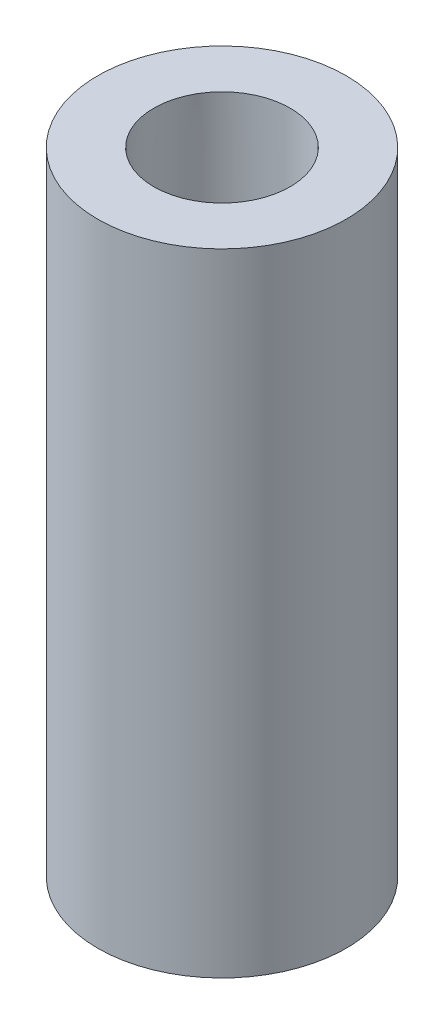
ISO-10303-21;
HEADER;
FILE_DESCRIPTION(('STEP AP214'),'2;1');
FILE_NAME('part.step','',(''),(''),'','','');
FILE_SCHEMA(('AUTOMOTIVE_DESIGN { 1 0 10303 214 1 1 1 1 }'));
ENDSEC;
DATA;
#1=APPLICATION_CONTEXT('core data for automotive mechanical design processes');
#2=APPLICATION_PROTOCOL_DEFINITION('international standard','automotive_design',2000,#1);
#3=PRODUCT_CONTEXT('',#1,'mechanical');
#4=PRODUCT('Part','Part','',(#3));
#5=PRODUCT_RELATED_PRODUCT_CATEGORY('part','',(#4));
#6=PRODUCT_DEFINITION_FORMATION('','',#4);
#7=PRODUCT_DEFINITION_CONTEXT('part definition',#1,'design');
#8=PRODUCT_DEFINITION('design','',#6,#7);
#9=PRODUCT_DEFINITION_SHAPE('','',#8);
#10=(LENGTH_UNIT() NAMED_UNIT(*) SI_UNIT(.MILLI.,.METRE.));
#11=(NAMED_UNIT(*) PLANE_ANGLE_UNIT() SI_UNIT($,.RADIAN.));
#12=(NAMED_UNIT(*) SI_UNIT($,.STERADIAN.) SOLID_ANGLE_UNIT());
#13=UNCERTAINTY_MEASURE_WITH_UNIT(LENGTH_MEASURE(1.E-05),#10,'distance_accuracy_value','');
#14=(GEOMETRIC_REPRESENTATION_CONTEXT(3) GLOBAL_UNCERTAINTY_ASSIGNED_CONTEXT((#13)) GLOBAL_UNIT_ASSIGNED_CONTEXT((#10,
#11,#12)) REPRESENTATION_CONTEXT('',''));
#15=CARTESIAN_POINT('',(0.,0.,0.));
#16=DIRECTION('',(0.,0.,1.));
#17=DIRECTION('',(1.,0.,0.));
#18=AXIS2_PLACEMENT_3D('',#15,#16,#17);
#19=CARTESIAN_POINT('',(-7.29247561548427,-19.585017995497,0.));
#20=DIRECTION('',(0.,-1.,0.));
#21=DIRECTION('',(0.,0.,-1.));
#22=AXIS2_PLACEMENT_3D('',#19,#20,#21);
#23=PLANE('',#22);
#24=CARTESIAN_POINT('',(0.,-19.585017995497,0.));
#25=DIRECTION('',(0.,1.,0.));
#26=DIRECTION('',(0.,0.,1.));
#27=AXIS2_PLACEMENT_3D('',#24,#25,#26);
#28=CIRCLE('',#27,2.49500000000001);
#29=CARTESIAN_POINT('',(0.,-19.585017995497,2.49500000000001));
#30=VERTEX_POINT('',#29);
#31=EDGE_CURVE('E46',#30,#30,#28,.T.);
#32=ORIENTED_EDGE('',*,*,#31,.T.);
#33=EDGE_LOOP('',(#32));
#34=FACE_BOUND('',#33,.T.);
#35=CARTESIAN_POINT('',(0.,-19.585017995497,0.));
#36=DIRECTION('',(0.,1.,0.));
#37=DIRECTION('',(0.,0.,1.));
#38=AXIS2_PLACEMENT_3D('',#35,#36,#37);
#39=CIRCLE('',#38,7.29247561548427);
#40=CARTESIAN_POINT('',(0.,-19.585017995497,7.29247561548427));
#41=VERTEX_POINT('',#40);
#42=EDGE_CURVE('E112',#41,#41,#39,.T.);
#43=ORIENTED_EDGE('',*,*,#42,.F.);
#44=EDGE_LOOP('',(#43));
#45=FACE_BOUND('',#44,.T.);
#46=ADVANCED_FACE('F31',(#34,#45),#23,.T.);
#47=CARTESIAN_POINT('',(0.,0.,0.));
#48=DIRECTION('',(0.,1.,0.));
#49=DIRECTION('',(0.,0.,1.));
#50=AXIS2_PLACEMENT_3D('',#47,#48,#49);
#51=CYLINDRICAL_SURFACE('',#50,2.49500000000001);
#52=CARTESIAN_POINT('',(2.,-9.79250899774851,-1.49165176901315));
#53=CARTESIAN_POINT('',(1.99998982466606,-9.71762488247213,-1.49167489274666));
#54=CARTESIAN_POINT('',(1.99574498655588,-9.64262984351396,-1.49740945606474));
#55=CARTESIAN_POINT('',(1.97915654142002,-9.49499776509533,-1.51925388355635));
#56=CARTESIAN_POINT('',(1.96678548125908,-9.42236959783292,-1.53539891441364));
#57=CARTESIAN_POINT('',(1.92924680344212,-9.25623840512728,-1.58246947915428));
#58=CARTESIAN_POINT('',(1.90111427849825,-9.16433750389393,-1.61659173983646));
#59=CARTESIAN_POINT('',(1.83361327224915,-8.98826631921876,-1.69277529359761));
#60=CARTESIAN_POINT('',(1.79421273527494,-8.90411900960605,-1.7348591187445));
#61=CARTESIAN_POINT('',(1.68893774586292,-8.7139737705995,-1.83841298141847));
#62=CARTESIAN_POINT('',(1.61864953572238,-8.61121235780178,-1.90135194853876));
#63=CARTESIAN_POINT('',(1.45994146979673,-8.41993064398826,-2.02578153122402));
#64=CARTESIAN_POINT('',(1.37153689545229,-8.3313984519734,-2.08727331908748));
#65=CARTESIAN_POINT('',(1.19619190276097,-8.18647073468363,-2.19143752418844));
#66=CARTESIAN_POINT('',(1.11243236020543,-8.12718339979482,-2.23542463288515));
#67=CARTESIAN_POINT('',(0.934056110916949,-8.02099228900925,-2.31561756072523));
#68=CARTESIAN_POINT('',(0.839456636099224,-7.97406923931981,-2.35183547412224));
#69=CARTESIAN_POINT('',(0.657083535405999,-7.90141135380085,-2.40849537899264));
#70=CARTESIAN_POINT('',(0.570691989746865,-7.87347417308106,-2.43054344633927));
#71=CARTESIAN_POINT('',(0.393150734970539,-7.8294043065651,-2.46548629446566));
#72=CARTESIAN_POINT('',(0.302003664579057,-7.8132651474165,-2.47838609461122));
#73=CARTESIAN_POINT('',(0.117141567273759,-7.79377379440852,-2.49397927286203));
#74=CARTESIAN_POINT('',(0.0234187082998375,-7.79046629062994,-2.49663697959767));
#75=CARTESIAN_POINT('',(-0.163268092184571,-7.79699718367013,-2.4914029310305));
#76=CARTESIAN_POINT('',(-0.256232001460473,-7.80683613596089,-2.48351072996661));
#77=CARTESIAN_POINT('',(-0.433487704804791,-7.83809159412591,-2.45859517652351));
#78=CARTESIAN_POINT('',(-0.517975128014014,-7.85884058743156,-2.4420986888115));
#79=CARTESIAN_POINT('',(-0.681874784745272,-7.91037340490264,-2.40150123178631));
#80=CARTESIAN_POINT('',(-0.761285726943328,-7.94115977025995,-2.37739833678555));
#81=CARTESIAN_POINT('',(-0.921140033084898,-8.01487637725988,-2.32043140165434));
#82=CARTESIAN_POINT('',(-1.00095225980917,-8.05868800079259,-2.28694889017801));
#83=CARTESIAN_POINT('',(-1.15222231005388,-8.15530058453991,-2.21459965280143));
#84=CARTESIAN_POINT('',(-1.22367549312921,-8.20810649827962,-2.17572996216981));
#85=CARTESIAN_POINT('',(-1.3717541020858,-8.3332169099053,-2.08620672146452));
#86=CARTESIAN_POINT('',(-1.44640685502858,-8.40729668642323,-2.0347762124977));
#87=CARTESIAN_POINT('',(-1.58296204551038,-8.56564854800117,-1.93045064795466));
#88=CARTESIAN_POINT('',(-1.64484845305624,-8.64993323870965,-1.87755384459038));
#89=CARTESIAN_POINT('',(-1.75032359684048,-8.8201620299209,-1.77935139615749));
#90=CARTESIAN_POINT('',(-1.79507104936191,-8.90524221914106,-1.73379481673728));
#91=CARTESIAN_POINT('',(-1.87275053722992,-9.08381683377043,-1.64957404744195));
#92=CARTESIAN_POINT('',(-1.90570838416486,-9.17729231016451,-1.61089489507782));
#93=CARTESIAN_POINT('',(-1.94997252725841,-9.3425062783132,-1.55674941035522));
#94=CARTESIAN_POINT('',(-1.9648188997743,-9.41212560534172,-1.53780195882057));
#95=CARTESIAN_POINT('',(-1.98706198759959,-9.55431535677362,-1.50895655009514));
#96=CARTESIAN_POINT('',(-1.99447550653383,-9.62687873698373,-1.49903818533492));
#97=CARTESIAN_POINT('',(-2.00126216673061,-9.77353015575105,-1.48997177667801));
#98=CARTESIAN_POINT('',(-2.00058713910168,-9.84762470247897,-1.49088825598389));
#99=CARTESIAN_POINT('',(-1.99114760336213,-9.99440262256299,-1.50346538347711));
#100=CARTESIAN_POINT('',(-1.98237181387586,-10.0670838835697,-1.51514101515961));
#101=CARTESIAN_POINT('',(-1.95434360682725,-10.2268779923362,-1.55119078789946));
#102=CARTESIAN_POINT('',(-1.93301984360635,-10.3130537261043,-1.57801059042187));
#103=CARTESIAN_POINT('',(-1.88048925430475,-10.4790883674332,-1.64025732065243));
#104=CARTESIAN_POINT('',(-1.84925282594222,-10.5589274473276,-1.67570995390655));
#105=CARTESIAN_POINT('',(-1.76142774781795,-10.7478749672857,-1.7686543767474));
#106=CARTESIAN_POINT('',(-1.69980191947365,-10.8533609115266,-1.82873602297468));
#107=CARTESIAN_POINT('',(-1.55903272490304,-11.0511390818371,-1.95016552386859));
#108=CARTESIAN_POINT('',(-1.47986830782118,-11.1434152317602,-2.01151481912313));
#109=CARTESIAN_POINT('',(-1.30297270705835,-11.3148933837964,-2.13045317021217));
#110=CARTESIAN_POINT('',(-1.20498080481901,-11.3938784831317,-2.18797200881422));
#111=CARTESIAN_POINT('',(-0.99201980728713,-11.5337715599526,-2.29235040362655));
#112=CARTESIAN_POINT('',(-0.877107471993559,-11.5947380011428,-2.33924431547544));
#113=CARTESIAN_POINT('',(-0.672327151145077,-11.67823859994,-2.40428044510312));
#114=CARTESIAN_POINT('',(-0.586305995402787,-11.7068267667444,-2.42681866213397));
#115=CARTESIAN_POINT('',(-0.409388118520747,-11.7522838020565,-2.46283298929266));
#116=CARTESIAN_POINT('',(-0.318495185739363,-11.769161638238,-2.47631603354238));
#117=CARTESIAN_POINT('',(-0.133950900946632,-11.790185563701,-2.49312987518579));
#118=CARTESIAN_POINT('',(-0.0402905062151502,-11.7942838149761,-2.49642252638842));
#119=CARTESIAN_POINT('',(0.146457885474472,-11.789324993236,-2.49244793570538));
#120=CARTESIAN_POINT('',(0.239545850261643,-11.7802671875054,-2.48518010566272));
#121=CARTESIAN_POINT('',(0.417166363855428,-11.7504768454989,-2.46142008760398));
#122=CARTESIAN_POINT('',(0.501887187561254,-11.7304188407559,-2.44546119686886));
#123=CARTESIAN_POINT('',(0.666357872024764,-11.6801976026301,-2.40585857045395));
#124=CARTESIAN_POINT('',(0.746106435320406,-11.650031744684,-2.38221283888845));
#125=CARTESIAN_POINT('',(0.9063665517643,-11.5777039853399,-2.32623575314042));
#126=CARTESIAN_POINT('',(0.986285957947629,-11.5346996891254,-2.29330944155594));
#127=CARTESIAN_POINT('',(1.1378812764632,-11.439700782837,-2.22199935985838));
#128=CARTESIAN_POINT('',(1.20955295709267,-11.387701591652,-2.18361281061843));
#129=CARTESIAN_POINT('',(1.35807755910617,-11.2644968624993,-2.09512852968524));
#130=CARTESIAN_POINT('',(1.43300117367251,-11.1915375290602,-2.04423980164582));
#131=CARTESIAN_POINT('',(1.57027734837633,-11.0355096418236,-1.94078443006735));
#132=CARTESIAN_POINT('',(1.63261344630004,-10.9524280746077,-1.88821569206073));
#133=CARTESIAN_POINT('',(1.74043817097857,-10.7826068090697,-1.78910007048878));
#134=CARTESIAN_POINT('',(1.78679170651862,-10.6965136358514,-1.7423878419969));
#135=CARTESIAN_POINT('',(1.86733148372942,-10.5155826735051,-1.65577103672732));
#136=CARTESIAN_POINT('',(1.9015406159041,-10.4207617645407,-1.61585372722828));
#137=CARTESIAN_POINT('',(1.9476685961153,-10.2526309684977,-1.55965323299791));
#138=CARTESIAN_POINT('',(1.96320062506381,-10.1815070665511,-1.53987365225458));
#139=CARTESIAN_POINT('',(1.98645272484821,-10.0361552139781,-1.50977194399549));
#140=CARTESIAN_POINT('',(1.99420265976459,-9.9619402768445,-1.49941367637286));
#141=CARTESIAN_POINT('',(1.99925328893917,-9.85574083720402,-1.49265094493208));
#142=CARTESIAN_POINT('',(2.00000429734928,-9.82413480979829,-1.49164200316565));
#143=CARTESIAN_POINT('',(2.,-9.79250899774851,-1.49165176901315));
#144=B_SPLINE_CURVE_WITH_KNOTS('',3,(#52,#53,#54,#55,#56,#57,#58,#59,#60,#61,#62,#63,#64,#65,
#66,#67,#68,#69,#70,#71,#72,#73,#74,#75,#76,#77,#78,#79,#80,#81,#82,#83,#84,#85,#86,#87,#88,#89,
#90,#91,#92,#93,#94,#95,#96,#97,#98,#99,#100,#101,#102,#103,#104,#105,#106,#107,#108,#109,#110,
#111,#112,#113,#114,#115,#116,#117,#118,#119,#120,#121,#122,#123,#124,#125,#126,#127,#128,#129,
#130,#131,#132,#133,#134,#135,#136,#137,#138,#139,#140,#141,#142,#143),.UNSPECIFIED.,.T.,.F.,(4,
2,2,2,2,2,2,2,2,2,2,2,2,2,2,2,2,2,2,2,2,2,2,2,2,2,2,2,2,2,2,2,2,2,2,2,2,2,2,2,2,2,2,2,2,4),(0.,
0.224540218510251,0.449842938623357,0.754087052814664,1.05920545199384,1.47570337962549,
1.89185142017391,2.22554056758936,2.55870643194784,2.8378267833189,3.11679387142062,
3.39673167826465,3.67668131358377,3.94121195444774,4.20580961940828,4.49577882936285,
4.78590825672258,5.13587564398762,5.48627982646593,5.80449053033697,6.12200023265026,
6.34219094402662,6.56188273504306,6.78288348104597,7.00419246472156,7.28085325020292,
7.55834813065941,7.96469001161735,8.37152227626493,8.78445775487322,9.19603832305256,
9.47511904116691,9.75398580500093,10.0338952093845,10.3138202036811,10.5782384217956,
10.8427253509242,11.13130329789,11.4200286530294,11.767697056078,12.1158172434591,
12.4399502395629,12.7634690052947,12.9889758777265,13.213614013238,13.3084440946512),.UNSPECIFIED.);
#145=CARTESIAN_POINT('',(2.,-9.79250899774851,-1.49165176901315));
#146=VERTEX_POINT('',#145);
#147=EDGE_CURVE('E68',#146,#146,#144,.T.);
#148=ORIENTED_EDGE('',*,*,#147,.F.);
#149=EDGE_LOOP('',(#148));
#150=FACE_BOUND('',#149,.T.);
#151=CARTESIAN_POINT('',(0.,0.,0.));
#152=DIRECTION('',(0.,1.,0.));
#153=DIRECTION('',(0.,0.,1.));
#154=AXIS2_PLACEMENT_3D('',#151,#152,#153);
#155=CIRCLE('',#154,2.49500000000001);
#156=CARTESIAN_POINT('',(0.,0.,2.49500000000001));
#157=VERTEX_POINT('',#156);
#158=EDGE_CURVE('E50',#157,#157,#155,.T.);
#159=ORIENTED_EDGE('',*,*,#158,.T.);
#160=EDGE_LOOP('',(#159));
#161=FACE_BOUND('',#160,.T.);
#162=ORIENTED_EDGE('',*,*,#31,.F.);
#163=EDGE_LOOP('',(#162));
#164=FACE_BOUND('',#163,.T.);
#165=ADVANCED_FACE('F80',(#150,#161,#164),#51,.F.);
#166=CARTESIAN_POINT('',(-2.49500000000001,0.,0.));
#167=DIRECTION('',(0.,1.,0.));
#168=DIRECTION('',(0.,0.,1.));
#169=AXIS2_PLACEMENT_3D('',#166,#167,#168);
#170=PLANE('',#169);
#171=CARTESIAN_POINT('',(0.,0.,0.));
#172=DIRECTION('',(0.,1.,0.));
#173=DIRECTION('',(0.,0.,1.));
#174=AXIS2_PLACEMENT_3D('',#171,#172,#173);
#175=CIRCLE('',#174,4.14646272180428);
#176=CARTESIAN_POINT('',(0.,0.,4.14646272180428));
#177=VERTEX_POINT('',#176);
#178=EDGE_CURVE('E121',#177,#177,#175,.T.);
#179=ORIENTED_EDGE('',*,*,#178,.T.);
#180=EDGE_LOOP('',(#179));
#181=FACE_BOUND('',#180,.T.);
#182=ORIENTED_EDGE('',*,*,#158,.F.);
#183=EDGE_LOOP('',(#182));
#184=FACE_BOUND('',#183,.T.);
#185=ADVANCED_FACE('F84',(#181,#184),#170,.T.);
#186=CARTESIAN_POINT('',(0.,0.,0.));
#187=DIRECTION('',(0.,-1.,0.));
#188=DIRECTION('',(0.,0.,-1.));
#189=AXIS2_PLACEMENT_3D('',#186,#187,#188);
#190=CONICAL_SURFACE('',#189,4.14646272180428,0.00838492842702194);
#191=CARTESIAN_POINT('',(-1.45363439605401,7.35982285450681,-3.81734555067866));
#192=CARTESIAN_POINT('',(-1.37775260705999,7.27952634143447,-3.84695939966204));
#193=CARTESIAN_POINT('',(-1.29511574731473,7.20541702021485,-3.87647408036762));
#194=CARTESIAN_POINT('',(-1.1179239707339,7.071373929072,-3.93240844464421));
#195=CARTESIAN_POINT('',(-1.02335009957816,7.01146314970264,-3.95882307411669));
#196=CARTESIAN_POINT('',(-0.823975652837646,6.90763552292585,-4.00596388212129));
#197=CARTESIAN_POINT('',(-0.719140639870238,6.86377504927495,-4.02666994877053));
#198=CARTESIAN_POINT('',(-0.50243001097105,6.79428844293701,-4.05998610212041));
#199=CARTESIAN_POINT('',(-0.390562085043993,6.76864275850398,-4.07260486829996));
#200=CARTESIAN_POINT('',(-0.17168400438132,6.73803033858224,-4.08772309021516));
#201=CARTESIAN_POINT('',(-0.0649105836458089,6.73169781253614,-4.09089053665268));
#202=CARTESIAN_POINT('',(0.148184986568771,6.73613863819855,-4.08868152771172));
#203=CARTESIAN_POINT('',(0.254507198025682,6.74690955895616,-4.08330628652432));
#204=CARTESIAN_POINT('',(0.457957612633007,6.78401846389735,-4.06507393891621));
#205=CARTESIAN_POINT('',(0.555276926742626,6.80952254795381,-4.05261815376159));
#206=CARTESIAN_POINT('',(0.744141576345093,6.87439113189154,-4.02167481965857));
#207=CARTESIAN_POINT('',(0.835685982835147,6.91375785516911,-4.00318630316943));
#208=CARTESIAN_POINT('',(1.01585305531571,7.00753376365608,-3.96060488782842));
#209=CARTESIAN_POINT('',(1.10405386438486,7.06263803267341,-3.93626407275558));
#210=CARTESIAN_POINT('',(1.27038011008582,7.18531560386841,-3.88469641556666));
#211=CARTESIAN_POINT('',(1.3484998543168,7.2528958989014,-3.85746795857772));
#212=CARTESIAN_POINT('',(1.50045765036173,7.40630895715194,-3.79971816817633));
#213=CARTESIAN_POINT('',(1.5731261759466,7.49328133376773,-3.76913559934103));
#214=CARTESIAN_POINT('',(1.70311720154602,7.67886154954201,-3.71050139783736));
#215=CARTESIAN_POINT('',(1.76043407373263,7.77747363671757,-3.68245069582847));
#216=CARTESIAN_POINT('',(1.85867094976231,7.98594617856807,-3.63191016857601));
#217=CARTESIAN_POINT('',(1.8993213383181,8.09595805359058,-3.60951387536887));
#218=CARTESIAN_POINT('',(1.96088736636001,8.32278016608222,-3.57428235468844));
#219=CARTESIAN_POINT('',(1.9818311352254,8.43958045989768,-3.56143350465201));
#220=CARTESIAN_POINT('',(2.00148892456654,8.66222973427492,-3.54827235851879));
#221=CARTESIAN_POINT('',(2.00246745130019,8.76780697929152,-3.54669650286305));
#222=CARTESIAN_POINT('',(1.98783550002972,8.97751907832941,-3.55290307105363));
#223=CARTESIAN_POINT('',(1.97222590301358,9.08165400865384,-3.56068499791511));
#224=CARTESIAN_POINT('',(1.926657810338,9.27904040751291,-3.58365002718012));
#225=CARTESIAN_POINT('',(1.89763207327258,9.37256834906538,-3.59835301346347));
#226=CARTESIAN_POINT('',(1.82673782434365,9.55353409685318,-3.63315646242616));
#227=CARTESIAN_POINT('',(1.78486533040119,9.6409700044288,-3.6532585984262));
#228=CARTESIAN_POINT('',(1.68500212902531,9.81599934118771,-3.69883666700949));
#229=CARTESIAN_POINT('',(1.6258799338695,9.90286146346895,-3.72463744427516));
#230=CARTESIAN_POINT('',(1.4950340666058,10.0660864452677,-3.77758722554014));
#231=CARTESIAN_POINT('',(1.42330265581816,10.1424428054606,-3.80473705011021));
#232=CARTESIAN_POINT('',(1.26078373158979,10.290296157457,-3.86051180918648));
#233=CARTESIAN_POINT('',(1.16880763766122,10.360542432141,-3.88901251736817));
#234=CARTESIAN_POINT('',(0.973163733469096,10.4845861588252,-3.94144710165046));
#235=CARTESIAN_POINT('',(0.869498157332251,10.538386746702,-3.96538184806463));
#236=CARTESIAN_POINT('',(0.656122646614601,10.6262161161197,-4.00538620294116));
#237=CARTESIAN_POINT('',(0.546661840272533,10.6607543633224,-4.02165650524888));
#238=CARTESIAN_POINT('',(0.32255284166842,10.7106313670885,-4.04537381846814));
#239=CARTESIAN_POINT('',(0.207908817763466,10.7259852768649,-4.0528277929207));
#240=CARTESIAN_POINT('',(-0.0116054334140267,10.7361789716665,-4.05776648228851));
#241=CARTESIAN_POINT('',(-0.116376446408328,10.7328188019026,-4.05612603359277));
#242=CARTESIAN_POINT('',(-0.323691422547334,10.7098695638851,-4.04505603359253));
#243=CARTESIAN_POINT('',(-0.426235528111555,10.6902815366224,-4.03562698191442));
#244=CARTESIAN_POINT('',(-0.623954076882161,10.6363650235016,-4.01022327364304));
#245=CARTESIAN_POINT('',(-0.719242458308388,10.602378305969,-3.99440075208845));
#246=CARTESIAN_POINT('',(-0.902807048619053,10.5209494383972,-3.95765716528663));
#247=CARTESIAN_POINT('',(-0.991081571835085,10.4735040662322,-3.93673487927786));
#248=CARTESIAN_POINT('',(-1.16520999395014,10.3625100493255,-3.8898754029319));
#249=CARTESIAN_POINT('',(-1.250399043058,10.2980282077344,-3.86368139189443));
#250=CARTESIAN_POINT('',(-1.40926998068496,10.1566094252425,-3.80987536473402));
#251=CARTESIAN_POINT('',(-1.4829436640216,10.0796636820681,-3.78226235596351));
#252=CARTESIAN_POINT('',(-1.62293776934002,9.90793621966763,-3.72603133588937));
#253=CARTESIAN_POINT('',(-1.68814330834252,9.81220496521052,-3.69751959191568));
#254=CARTESIAN_POINT('',(-1.80150162005925,9.60985491540384,-3.6455316105833));
#255=CARTESIAN_POINT('',(-1.84966006289681,9.50323975543721,-3.62205369992155));
#256=CARTESIAN_POINT('',(-1.92559839195358,9.28563787981553,-3.58431886157495));
#257=CARTESIAN_POINT('',(-1.95402792887605,9.17493157827338,-3.56977001165241));
#258=CARTESIAN_POINT('',(-1.9915719846527,8.94948863763209,-3.55113630580983));
#259=CARTESIAN_POINT('',(-2.00071034635145,8.83475715204395,-3.54703853162185));
#260=CARTESIAN_POINT('',(-1.99929150046224,8.61932189543869,-3.54990498919758));
#261=CARTESIAN_POINT('',(-1.99095386018027,8.51857749281271,-3.55560787538987));
#262=CARTESIAN_POINT('',(-1.95940979376801,8.32019859134454,-3.57498342450896));
#263=CARTESIAN_POINT('',(-1.93619450125261,8.22256598343236,-3.58866083944326));
#264=CARTESIAN_POINT('',(-1.87598823263451,8.03309731451248,-3.62228274654322));
#265=CARTESIAN_POINT('',(-1.83902711674218,7.94124918986464,-3.64221363964061));
#266=CARTESIAN_POINT('',(-1.75255082827507,7.76487739340021,-3.68623803802994));
#267=CARTESIAN_POINT('',(-1.70304859488437,7.68034629218662,-3.71032724490649));
#268=CARTESIAN_POINT('',(-1.61860170553291,7.55755977111437,-3.74870641793131));
#269=CARTESIAN_POINT('',(-1.58773405967505,7.51621113376846,-3.76228713649286));
#270=CARTESIAN_POINT('',(-1.52294566115041,7.43606722615613,-3.78970093243124));
#271=CARTESIAN_POINT('',(-1.48902470041777,7.3972721302112,-3.80353402695475));
#272=CARTESIAN_POINT('',(-1.45363439605401,7.35982285450681,-3.81734555067866));
#273=B_SPLINE_CURVE_WITH_KNOTS('',3,(#191,#192,#193,#194,#195,#196,#197,#198,#199,#200,#201,
#202,#203,#204,#205,#206,#207,#208,#209,#210,#211,#212,#213,#214,#215,#216,#217,#218,#219,#220,
#221,#222,#223,#224,#225,#226,#227,#228,#229,#230,#231,#232,#233,#234,#235,#236,#237,#238,#239,
#240,#241,#242,#243,#244,#245,#246,#247,#248,#249,#250,#251,#252,#253,#254,#255,#256,#257,#258,
#259,#260,#261,#262,#263,#264,#265,#266,#267,#268,#269,#270,#271,#272),.UNSPECIFIED.,.T.,.F.,(4,
2,2,2,2,2,2,2,2,2,2,2,2,2,2,2,2,2,2,2,2,2,2,2,2,2,2,2,2,2,2,2,2,2,2,2,2,2,2,2,4),(0.,
0.342955396226069,0.686462375263197,1.03116453524208,1.37549613059901,1.69483593110692,
2.01413034720176,2.31691162476474,2.61974148684436,2.93885642160548,3.25815076745396,
3.60873039118459,3.95943836002685,4.3156149722357,4.6712824005054,4.98635278801902,
5.30140644311882,5.59725360212442,5.89319255698316,6.21646434100618,6.53993522443304,
6.89577274202693,7.25154236585676,7.5973921441392,7.94296857155912,8.25591599147192,
8.56884333786839,8.8747259816669,9.18068191848051,9.50932463649849,9.83820046911354,
10.194322993431,10.5503269544338,10.8939670893055,11.2371822543751,11.5394528783861,
11.8419038092856,12.1437015241945,12.4451891211882,12.6051282628321,12.7650783116718),.UNSPECIFIED.);
#274=CARTESIAN_POINT('',(-1.45363439605401,7.35982285450681,-3.81734555067866));
#275=VERTEX_POINT('',#274);
#276=EDGE_CURVE('E74',#275,#275,#273,.T.);
#277=ORIENTED_EDGE('',*,*,#276,.F.);
#278=EDGE_LOOP('',(#277));
#279=FACE_BOUND('',#278,.T.);
#280=CARTESIAN_POINT('',(0.,17.4669695287398,0.));
#281=DIRECTION('',(0.,1.,0.));
#282=DIRECTION('',(0.,0.,1.));
#283=AXIS2_PLACEMENT_3D('',#280,#281,#282);
#284=CIRCLE('',#283,4.);
#285=CARTESIAN_POINT('',(0.,17.4669695287398,4.));
#286=VERTEX_POINT('',#285);
#287=EDGE_CURVE('E115',#286,#286,#284,.T.);
#288=ORIENTED_EDGE('',*,*,#287,.T.);
#289=EDGE_LOOP('',(#288));
#290=FACE_BOUND('',#289,.T.);
#291=ORIENTED_EDGE('',*,*,#178,.F.);
#292=EDGE_LOOP('',(#291));
#293=FACE_BOUND('',#292,.T.);
#294=ADVANCED_FACE('F87',(#279,#290,#293),#190,.F.);
#295=CARTESIAN_POINT('',(-4.,17.4669695287398,0.));
#296=DIRECTION('',(0.,1.,0.));
#297=DIRECTION('',(0.,0.,1.));
#298=AXIS2_PLACEMENT_3D('',#295,#296,#297);
#299=PLANE('',#298);
#300=CARTESIAN_POINT('',(0.,17.4669695287398,0.));
#301=DIRECTION('',(0.,1.,0.));
#302=DIRECTION('',(0.,0.,1.));
#303=AXIS2_PLACEMENT_3D('',#300,#301,#302);
#304=CIRCLE('',#303,7.29247561548427);
#305=CARTESIAN_POINT('',(0.,17.4669695287398,7.29247561548427));
#306=VERTEX_POINT('',#305);
#307=EDGE_CURVE('E114',#306,#306,#304,.T.);
#308=ORIENTED_EDGE('',*,*,#307,.T.);
#309=EDGE_LOOP('',(#308));
#310=FACE_BOUND('',#309,.T.);
#311=ORIENTED_EDGE('',*,*,#287,.F.);
#312=EDGE_LOOP('',(#311));
#313=FACE_BOUND('',#312,.T.);
#314=ADVANCED_FACE('F91',(#310,#313),#299,.T.);
#315=CARTESIAN_POINT('',(0.,0.,0.));
#316=DIRECTION('',(0.,1.,0.));
#317=DIRECTION('',(0.,0.,1.));
#318=AXIS2_PLACEMENT_3D('',#315,#316,#317);
#319=CYLINDRICAL_SURFACE('',#318,7.29247561548427);
#320=CARTESIAN_POINT('',(0.,10.7334847643699,-7.29247561548427));
#321=CARTESIAN_POINT('',(0.110137388313957,10.7334824001988,-7.29247407855387));
#322=CARTESIAN_POINT('',(0.220299669623404,10.7243566429064,-7.2899561228288));
#323=CARTESIAN_POINT('',(0.437443150582296,10.688164100965,-7.28015632731556));
#324=CARTESIAN_POINT('',(0.544422926008705,10.6610894064176,-7.27287238722911));
#325=CARTESIAN_POINT('',(0.752036214773038,10.5899511727739,-7.25434331657968));
#326=CARTESIAN_POINT('',(0.852677966254216,10.5459102397271,-7.24310345865046));
#327=CARTESIAN_POINT('',(1.04514732457353,10.4421754709009,-7.21784608064538));
#328=CARTESIAN_POINT('',(1.13697420997169,10.382480355417,-7.20382833350441));
#329=CARTESIAN_POINT('',(1.31144824014795,10.2475941692643,-7.17414210765367));
#330=CARTESIAN_POINT('',(1.39384964013627,10.1720917167543,-7.15844414861826));
#331=CARTESIAN_POINT('',(1.5449938905824,10.0083992699057,-7.12735303309452));
#332=CARTESIAN_POINT('',(1.61373487302036,9.92020754318719,-7.11195991855148));
#333=CARTESIAN_POINT('',(1.7368256398389,9.73165289191583,-7.08291762406906));
#334=CARTESIAN_POINT('',(1.79088897837686,9.63109673392725,-7.06930552217439));
#335=CARTESIAN_POINT('',(1.88124337019991,9.42188793254185,-7.04580150679833));
#336=CARTESIAN_POINT('',(1.91753791188441,9.31323688317716,-7.03590886319532));
#337=CARTESIAN_POINT('',(1.97046382139627,9.09365282650539,-7.02126884106405));
#338=CARTESIAN_POINT('',(1.98754243370798,8.98283559914982,-7.01640465582508));
#339=CARTESIAN_POINT('',(2.00294657345406,8.75981034453903,-7.01202362004608));
#340=CARTESIAN_POINT('',(2.00127582523577,8.64760259791789,-7.01250570752951));
#341=CARTESIAN_POINT('',(1.97958290545275,8.42850325520336,-7.01865842320621));
#342=CARTESIAN_POINT('',(1.9601059569635,8.3215526531505,-7.02417489068065));
#343=CARTESIAN_POINT('',(1.9042284262843,8.11249878834705,-7.03952740311933));
#344=CARTESIAN_POINT('',(1.86782642210153,8.01039593368432,-7.04936381102824));
#345=CARTESIAN_POINT('',(1.77869730805696,7.81253394593831,-7.07238066749246));
#346=CARTESIAN_POINT('',(1.72578221749158,7.71686411944609,-7.08559928921787));
#347=CARTESIAN_POINT('',(1.60526000760543,7.53557211834084,-7.11387112707875));
#348=CARTESIAN_POINT('',(1.53764984662762,7.44995202953006,-7.12892472274231));
#349=CARTESIAN_POINT('',(1.38688631580235,7.28807957511229,-7.15980848203901));
#350=CARTESIAN_POINT('',(1.30327622060629,7.21225365142224,-7.17564749651923));
#351=CARTESIAN_POINT('',(1.12433206628466,7.07560939822133,-7.20585174436796));
#352=CARTESIAN_POINT('',(1.02899749103908,7.01479172973919,-7.2202169128056));
#353=CARTESIAN_POINT('',(0.828625340748794,6.90968747840586,-7.24595189337098));
#354=CARTESIAN_POINT('',(0.723543285428755,6.86548184544124,-7.25730696030331));
#355=CARTESIAN_POINT('',(0.507055613350063,6.7954889505592,-7.27563592029915));
#356=CARTESIAN_POINT('',(0.395651467374406,6.76969742355782,-7.28261082785218));
#357=CARTESIAN_POINT('',(0.173318195584873,6.73794319190871,-7.29123861639706));
#358=CARTESIAN_POINT('',(0.0624777222426298,6.73140112712078,-7.2930469482046));
#359=CARTESIAN_POINT('',(-0.158717968228614,6.73672634226622,-7.29158675393515));
#360=CARTESIAN_POINT('',(-0.269073237305899,6.74859160079462,-7.28831878531336));
#361=CARTESIAN_POINT('',(-0.484072193866796,6.789920738131,-7.27717392500235));
#362=CARTESIAN_POINT('',(-0.588783490681157,6.81905811055887,-7.26938259637415));
#363=CARTESIAN_POINT('',(-0.791819161406241,6.89372224901304,-7.25007809369941));
#364=CARTESIAN_POINT('',(-0.890142822231321,6.93925084117938,-7.23856450497176));
#365=CARTESIAN_POINT('',(-1.07983749524169,7.04645707160127,-7.21273246321955));
#366=CARTESIAN_POINT('',(-1.17102556498665,7.10844545086711,-7.19836154199583));
#367=CARTESIAN_POINT('',(-1.34190754688046,7.24642395459478,-7.16847421233408));
#368=CARTESIAN_POINT('',(-1.42159904709535,7.32241700958723,-7.15295756455654));
#369=CARTESIAN_POINT('',(-1.56969184245996,7.4889566453807,-7.12195002996412));
#370=CARTESIAN_POINT('',(-1.63768343747193,7.57987098502601,-7.10647383762319));
#371=CARTESIAN_POINT('',(-1.75745852033475,7.77214911487564,-7.0778066693372));
#372=CARTESIAN_POINT('',(-1.80924264857771,7.87351249200542,-7.06461560311106));
#373=CARTESIAN_POINT('',(-1.89474562006776,8.08333407183637,-7.04216550497427));
#374=CARTESIAN_POINT('',(-1.9285663307289,8.1917482678248,-7.03288436401898));
#375=CARTESIAN_POINT('',(-1.97740579336184,8.41302536092244,-7.01931063066804));
#376=CARTESIAN_POINT('',(-1.99242969230267,8.5258870314831,-7.01501667269813));
#377=CARTESIAN_POINT('',(-2.00294066046359,8.74864803716007,-7.01202216064634));
#378=CARTESIAN_POINT('',(-1.99908812578633,8.85851412259431,-7.01313252592214));
#379=CARTESIAN_POINT('',(-1.97349718968112,9.07596573907385,-7.02037624317284));
#380=CARTESIAN_POINT('',(-1.95175930002939,9.18355133528331,-7.02650945142276));
#381=CARTESIAN_POINT('',(-1.89140760362684,9.392502936022,-7.04299199100731));
#382=CARTESIAN_POINT('',(-1.85294135140143,9.49391467790701,-7.05330440616147));
#383=CARTESIAN_POINT('',(-1.7603390646947,9.688923329542,-7.07698246464216));
#384=CARTESIAN_POINT('',(-1.70620044502875,9.78251894672393,-7.09034861161039));
#385=CARTESIAN_POINT('',(-1.58182107231958,9.96237191765132,-7.11914539782795));
#386=CARTESIAN_POINT('',(-1.51113333205403,10.0483119962289,-7.13462717676107));
#387=CARTESIAN_POINT('',(-1.35650238768382,10.2073248450968,-7.165633932157));
#388=CARTESIAN_POINT('',(-1.27255592299185,10.2803944409022,-7.18115891832032));
#389=CARTESIAN_POINT('',(-1.09145908504237,10.413251317782,-7.21093055094102));
#390=CARTESIAN_POINT('',(-0.994049218932967,10.4726940764407,-7.22513953792747));
#391=CARTESIAN_POINT('',(-0.790230948783247,10.5742676730368,-7.25025844410999));
#392=CARTESIAN_POINT('',(-0.683828035735834,10.6164089841521,-7.2611703580814));
#393=CARTESIAN_POINT('',(-0.48160610797215,10.6770545869658,-7.27715257729357));
#394=CARTESIAN_POINT('',(-0.386610772146256,10.698165051503,-7.28285566038848));
#395=CARTESIAN_POINT('',(-0.19441659134705,10.7263804023949,-7.29051764895548));
#396=CARTESIAN_POINT('',(-0.0972179934221601,10.7334868512177,-7.29247697212884));
#397=CARTESIAN_POINT('',(0.,10.7334847643699,-7.29247561548427));
#398=B_SPLINE_CURVE_WITH_KNOTS('',3,(#320,#321,#322,#323,#324,#325,#326,#327,#328,#329,#330,
#331,#332,#333,#334,#335,#336,#337,#338,#339,#340,#341,#342,#343,#344,#345,#346,#347,#348,#349,
#350,#351,#352,#353,#354,#355,#356,#357,#358,#359,#360,#361,#362,#363,#364,#365,#366,#367,#368,
#369,#370,#371,#372,#373,#374,#375,#376,#377,#378,#379,#380,#381,#382,#383,#384,#385,#386,#387,
#388,#389,#390,#391,#392,#393,#394,#395,#396,#397),.UNSPECIFIED.,.T.,.F.,(4,2,2,2,2,2,2,2,2,2,2,
2,2,2,2,2,2,2,2,2,2,2,2,2,2,2,2,2,2,2,2,2,2,2,2,2,2,2,4),(0.,0.330055517050228,
0.660256582699092,0.990019197162725,1.31980877760191,1.65683741557808,1.99391210951188,
2.33715659115123,2.68033365941999,3.015346564637,3.35029292452657,3.67531475859621,
4.00036390496891,4.32925731333701,4.65821886259969,4.99855856077461,5.33891324631358,
5.680905600255,6.0228187160443,6.35433019380491,6.68580526912384,7.01120556293343,
7.33664212069986,7.66872322386283,8.0008738953008,8.34297403052861,8.68506064693219,
9.02518605846109,9.36521831598095,9.69344119019996,10.0216546728903,10.3470300343331,
10.6724590976274,11.0079725887858,11.3435687183071,11.6868911267496,12.0300054024838,
12.3213770815731,12.6127162496498),.UNSPECIFIED.);
#399=CARTESIAN_POINT('',(0.,10.7334847643699,-7.29247561548427));
#400=VERTEX_POINT('',#399);
#401=EDGE_CURVE('E10',#400,#400,#398,.T.);
#402=ORIENTED_EDGE('',*,*,#401,.F.);
#403=EDGE_LOOP('',(#402));
#404=FACE_BOUND('',#403,.T.);
#405=CARTESIAN_POINT('',(0.,-7.79250899774851,-7.29247561548427));
#406=CARTESIAN_POINT('',(0.110137388313957,-7.79251136191959,-7.29247407855387));
#407=CARTESIAN_POINT('',(0.220299669623404,-7.80163711921204,-7.2899561228288));
#408=CARTESIAN_POINT('',(0.437443150582296,-7.8378296611534,-7.28015632731556));
#409=CARTESIAN_POINT('',(0.544422926008705,-7.86490435570086,-7.27287238722911));
#410=CARTESIAN_POINT('',(0.752036214773037,-7.93604258934453,-7.25434331657968));
#411=CARTESIAN_POINT('',(0.852677966254215,-7.98008352239128,-7.24310345865046));
#412=CARTESIAN_POINT('',(1.04514732457353,-8.0838182912175,-7.21784608064538));
#413=CARTESIAN_POINT('',(1.13697420997168,-8.14351340670138,-7.20382833350441));
#414=CARTESIAN_POINT('',(1.31144824014795,-8.27839959285409,-7.17414210765367));
#415=CARTESIAN_POINT('',(1.39384964013627,-8.35390204536418,-7.15844414861826));
#416=CARTESIAN_POINT('',(1.5449938905824,-8.51759449221271,-7.12735303309452));
#417=CARTESIAN_POINT('',(1.61373487302036,-8.60578621893124,-7.11195991855148));
#418=CARTESIAN_POINT('',(1.7368256398389,-8.7943408702026,-7.08291762406906));
#419=CARTESIAN_POINT('',(1.79088897837686,-8.89489702819118,-7.06930552217439));
#420=CARTESIAN_POINT('',(1.88124337019991,-9.10410582957658,-7.04580150679833));
#421=CARTESIAN_POINT('',(1.91753791188441,-9.21275687894127,-7.03590886319532));
#422=CARTESIAN_POINT('',(1.97046382139626,-9.43234093561304,-7.02126884106405));
#423=CARTESIAN_POINT('',(1.98754243370798,-9.54315816296861,-7.01640465582508));
#424=CARTESIAN_POINT('',(2.00294657345406,-9.7661834175794,-7.01202362004608));
#425=CARTESIAN_POINT('',(2.00127582523577,-9.87839116420054,-7.01250570752951));
#426=CARTESIAN_POINT('',(1.97958290545275,-10.0974905069151,-7.01865842320621));
#427=CARTESIAN_POINT('',(1.9601059569635,-10.2044411089679,-7.02417489068065));
#428=CARTESIAN_POINT('',(1.9042284262843,-10.4134949737714,-7.03952740311933));
#429=CARTESIAN_POINT('',(1.86782642210153,-10.5155978284341,-7.04936381102824));
#430=CARTESIAN_POINT('',(1.77869730805696,-10.7134598161801,-7.07238066749246));
#431=CARTESIAN_POINT('',(1.72578221749158,-10.8091296426723,-7.08559928921787));
#432=CARTESIAN_POINT('',(1.60526000760543,-10.9904216437776,-7.11387112707875));
#433=CARTESIAN_POINT('',(1.53764984662762,-11.0760417325884,-7.12892472274231));
#434=CARTESIAN_POINT('',(1.38688631580235,-11.2379141870061,-7.15980848203901));
#435=CARTESIAN_POINT('',(1.30327622060629,-11.3137401106962,-7.17564749651923));
#436=CARTESIAN_POINT('',(1.12433206628466,-11.4503843638971,-7.20585174436796));
#437=CARTESIAN_POINT('',(1.02899749103908,-11.5112020323792,-7.2202169128056));
#438=CARTESIAN_POINT('',(0.828625340748793,-11.6163062837126,-7.24595189337098));
#439=CARTESIAN_POINT('',(0.723543285428755,-11.6605119166772,-7.25730696030331));
#440=CARTESIAN_POINT('',(0.507055613350063,-11.7305048115592,-7.27563592029915));
#441=CARTESIAN_POINT('',(0.395651467374406,-11.7562963385606,-7.28261082785218));
#442=CARTESIAN_POINT('',(0.173318195584873,-11.7880505702097,-7.29123861639706));
#443=CARTESIAN_POINT('',(0.0624777222426298,-11.7945926349977,-7.2930469482046));
#444=CARTESIAN_POINT('',(-0.158717968228614,-11.7892674198522,-7.29158675393515));
#445=CARTESIAN_POINT('',(-0.269073237305899,-11.7774021613238,-7.28831878531336));
#446=CARTESIAN_POINT('',(-0.484072193866796,-11.7360730239874,-7.27717392500235));
#447=CARTESIAN_POINT('',(-0.588783490681157,-11.7069356515596,-7.26938259637415));
#448=CARTESIAN_POINT('',(-0.79181916140624,-11.6322715131054,-7.25007809369941));
#449=CARTESIAN_POINT('',(-0.890142822231321,-11.586742920939,-7.23856450497176));
#450=CARTESIAN_POINT('',(-1.07983749524169,-11.4795366905172,-7.21273246321955));
#451=CARTESIAN_POINT('',(-1.17102556498665,-11.4175483112513,-7.19836154199583));
#452=CARTESIAN_POINT('',(-1.34190754688046,-11.2795698075236,-7.16847421233408));
#453=CARTESIAN_POINT('',(-1.42159904709535,-11.2035767525312,-7.15295756455654));
#454=CARTESIAN_POINT('',(-1.56969184245996,-11.0370371167377,-7.12195002996412));
#455=CARTESIAN_POINT('',(-1.63768343747193,-10.9461227770924,-7.10647383762319));
#456=CARTESIAN_POINT('',(-1.75745852033475,-10.7538446472428,-7.0778066693372));
#457=CARTESIAN_POINT('',(-1.80924264857771,-10.652481270113,-7.06461560311106));
#458=CARTESIAN_POINT('',(-1.89474562006776,-10.4426596902821,-7.04216550497427));
#459=CARTESIAN_POINT('',(-1.9285663307289,-10.3342454942936,-7.03288436401898));
#460=CARTESIAN_POINT('',(-1.97740579336184,-10.112968401196,-7.01931063066804));
#461=CARTESIAN_POINT('',(-1.99242969230267,-10.0001067306353,-7.01501667269812));
#462=CARTESIAN_POINT('',(-2.00294066046359,-9.77734572495836,-7.01202216064634));
#463=CARTESIAN_POINT('',(-1.99908812578633,-9.66747963952412,-7.01313252592214));
#464=CARTESIAN_POINT('',(-1.97349718968112,-9.45002802304458,-7.02037624317284));
#465=CARTESIAN_POINT('',(-1.95175930002939,-9.34244242683512,-7.02650945142276));
#466=CARTESIAN_POINT('',(-1.89140760362684,-9.13349082609643,-7.04299199100731));
#467=CARTESIAN_POINT('',(-1.85294135140143,-9.03207908421142,-7.05330440616147));
#468=CARTESIAN_POINT('',(-1.7603390646947,-8.83707043257643,-7.07698246464216));
#469=CARTESIAN_POINT('',(-1.70620044502875,-8.7434748153945,-7.09034861161039));
#470=CARTESIAN_POINT('',(-1.58182107231958,-8.56362184446711,-7.11914539782795));
#471=CARTESIAN_POINT('',(-1.51113333205403,-8.47768176588951,-7.13462717676107));
#472=CARTESIAN_POINT('',(-1.35650238768382,-8.31866891702161,-7.165633932157));
#473=CARTESIAN_POINT('',(-1.27255592299185,-8.24559932121627,-7.18115891832032));
#474=CARTESIAN_POINT('',(-1.09145908504237,-8.11274244433643,-7.21093055094102));
#475=CARTESIAN_POINT('',(-0.994049218932967,-8.05329968567774,-7.22513953792747));
#476=CARTESIAN_POINT('',(-0.790230948783247,-7.95172608908166,-7.25025844410999));
#477=CARTESIAN_POINT('',(-0.683828035735834,-7.90958477796637,-7.2611703580814));
#478=CARTESIAN_POINT('',(-0.48160610797215,-7.84893917515267,-7.27715257729357));
#479=CARTESIAN_POINT('',(-0.386610772146256,-7.82782871061544,-7.28285566038848));
#480=CARTESIAN_POINT('',(-0.19441659134705,-7.7996133597235,-7.29051764895548));
#481=CARTESIAN_POINT('',(-0.0972179934221601,-7.7925069109007,-7.29247697212884));
#482=CARTESIAN_POINT('',(0.,-7.79250899774851,-7.29247561548427));
#483=B_SPLINE_CURVE_WITH_KNOTS('',3,(#405,#406,#407,#408,#409,#410,#411,#412,#413,#414,#415,
#416,#417,#418,#419,#420,#421,#422,#423,#424,#425,#426,#427,#428,#429,#430,#431,#432,#433,#434,
#435,#436,#437,#438,#439,#440,#441,#442,#443,#444,#445,#446,#447,#448,#449,#450,#451,#452,#453,
#454,#455,#456,#457,#458,#459,#460,#461,#462,#463,#464,#465,#466,#467,#468,#469,#470,#471,#472,
#473,#474,#475,#476,#477,#478,#479,#480,#481,#482),.UNSPECIFIED.,.T.,.F.,(4,2,2,2,2,2,2,2,2,2,2,
2,2,2,2,2,2,2,2,2,2,2,2,2,2,2,2,2,2,2,2,2,2,2,2,2,2,2,4),(0.,0.330055517050228,
0.660256582699092,0.990019197162723,1.31980877760191,1.65683741557808,1.99391210951188,
2.33715659115123,2.68033365941999,3.015346564637,3.35029292452657,3.67531475859621,
4.00036390496891,4.32925731333701,4.65821886259968,4.99855856077461,5.33891324631358,
5.680905600255,6.0228187160443,6.3543301938049,6.68580526912383,7.01120556293342,
7.33664212069986,7.66872322386283,8.0008738953008,8.34297403052861,8.68506064693218,
9.02518605846108,9.36521831598095,9.69344119019996,10.0216546728903,10.347030034333,
10.6724590976274,11.0079725887858,11.3435687183071,11.6868911267496,12.0300054024838,
12.3213770815731,12.6127162496498),.UNSPECIFIED.);
#484=CARTESIAN_POINT('',(0.,-7.79250899774851,-7.29247561548427));
#485=VERTEX_POINT('',#484);
#486=EDGE_CURVE('E42',#485,#485,#483,.T.);
#487=ORIENTED_EDGE('',*,*,#486,.F.);
#488=EDGE_LOOP('',(#487));
#489=FACE_BOUND('',#488,.T.);
#490=ORIENTED_EDGE('',*,*,#42,.T.);
#491=EDGE_LOOP('',(#490));
#492=FACE_BOUND('',#491,.T.);
#493=ORIENTED_EDGE('',*,*,#307,.F.);
#494=EDGE_LOOP('',(#493));
#495=FACE_BOUND('',#494,.T.);
#496=ADVANCED_FACE('F57',(#404,#489,#492,#495),#319,.T.);
#497=CARTESIAN_POINT('',(0.,-9.79250899774851,-7.29247561548427));
#498=DIRECTION('',(0.,0.,1.));
#499=DIRECTION('',(1.,0.,0.));
#500=AXIS2_PLACEMENT_3D('',#497,#498,#499);
#501=CYLINDRICAL_SURFACE('',#500,2.);
#502=ORIENTED_EDGE('',*,*,#147,.T.);
#503=EDGE_LOOP('',(#502));
#504=FACE_BOUND('',#503,.T.);
#505=ORIENTED_EDGE('',*,*,#486,.T.);
#506=EDGE_LOOP('',(#505));
#507=FACE_BOUND('',#506,.T.);
#508=ADVANCED_FACE('F60',(#504,#507),#501,.F.);
#509=CARTESIAN_POINT('',(0.,8.73348476436991,-7.29247561548427));
#510=DIRECTION('',(0.,0.,1.));
#511=DIRECTION('',(1.,0.,0.));
#512=AXIS2_PLACEMENT_3D('',#509,#510,#511);
#513=CYLINDRICAL_SURFACE('',#512,2.);
#514=ORIENTED_EDGE('',*,*,#276,.T.);
#515=EDGE_LOOP('',(#514));
#516=FACE_BOUND('',#515,.T.);
#517=ORIENTED_EDGE('',*,*,#401,.T.);
#518=EDGE_LOOP('',(#517));
#519=FACE_BOUND('',#518,.T.);
#520=ADVANCED_FACE('F63',(#516,#519),#513,.F.);
#521=CLOSED_SHELL('',(#46,#165,#185,#294,#314,#496,#508,#520));
#522=MANIFOLD_SOLID_BREP('B2',#521);
#523=ADVANCED_BREP_SHAPE_REPRESENTATION('',(#18,#522),#14);
#524=SHAPE_DEFINITION_REPRESENTATION(#9,#523);
ENDSEC;
END-ISO-10303-21;
